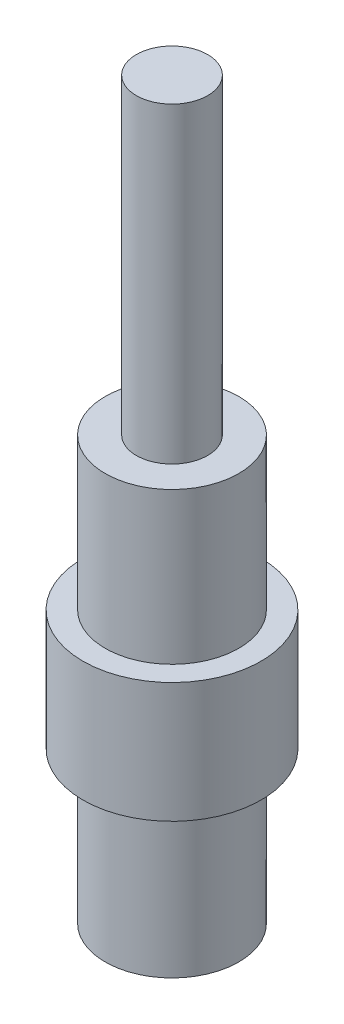
ISO-10303-21;
HEADER;
FILE_DESCRIPTION(('STEP AP214'),'2;1');
FILE_NAME('part.step','',(''),(''),'','','');
FILE_SCHEMA(('AUTOMOTIVE_DESIGN { 1 0 10303 214 1 1 1 1 }'));
ENDSEC;
DATA;
#1=APPLICATION_CONTEXT('core data for automotive mechanical design processes');
#2=APPLICATION_PROTOCOL_DEFINITION('international standard','automotive_design',2000,#1);
#3=PRODUCT_CONTEXT('',#1,'mechanical');
#4=PRODUCT('Part','Part','',(#3));
#5=PRODUCT_RELATED_PRODUCT_CATEGORY('part','',(#4));
#6=PRODUCT_DEFINITION_FORMATION('','',#4);
#7=PRODUCT_DEFINITION_CONTEXT('part definition',#1,'design');
#8=PRODUCT_DEFINITION('design','',#6,#7);
#9=PRODUCT_DEFINITION_SHAPE('','',#8);
#10=(LENGTH_UNIT() NAMED_UNIT(*) SI_UNIT(.MILLI.,.METRE.));
#11=(NAMED_UNIT(*) PLANE_ANGLE_UNIT() SI_UNIT($,.RADIAN.));
#12=(NAMED_UNIT(*) SI_UNIT($,.STERADIAN.) SOLID_ANGLE_UNIT());
#13=UNCERTAINTY_MEASURE_WITH_UNIT(LENGTH_MEASURE(1.E-05),#10,'distance_accuracy_value','');
#14=(GEOMETRIC_REPRESENTATION_CONTEXT(3) GLOBAL_UNCERTAINTY_ASSIGNED_CONTEXT((#13)) GLOBAL_UNIT_ASSIGNED_CONTEXT((#10,
#11,#12)) REPRESENTATION_CONTEXT('',''));
#15=CARTESIAN_POINT('',(0.,0.,0.));
#16=DIRECTION('',(0.,0.,1.));
#17=DIRECTION('',(1.,0.,0.));
#18=AXIS2_PLACEMENT_3D('',#15,#16,#17);
#19=CARTESIAN_POINT('',(7.5,0.,0.));
#20=DIRECTION('',(0.,-1.,0.));
#21=DIRECTION('',(0.,0.,-1.));
#22=AXIS2_PLACEMENT_3D('',#19,#20,#21);
#23=PLANE('',#22);
#24=CARTESIAN_POINT('',(0.,0.,0.));
#25=DIRECTION('',(0.,-1.,0.));
#26=DIRECTION('',(0.,0.,-1.));
#27=AXIS2_PLACEMENT_3D('',#24,#25,#26);
#28=CIRCLE('',#27,7.5);
#29=CARTESIAN_POINT('',(0.,0.,-7.5));
#30=VERTEX_POINT('',#29);
#31=EDGE_CURVE('E10',#30,#30,#28,.T.);
#32=ORIENTED_EDGE('',*,*,#31,.T.);
#33=EDGE_LOOP('',(#32));
#34=FACE_BOUND('',#33,.T.);
#35=ADVANCED_FACE('F32',(#34),#23,.T.);
#36=CARTESIAN_POINT('',(0.,0.,0.));
#37=DIRECTION('',(0.,-1.,0.));
#38=DIRECTION('',(0.,0.,-1.));
#39=AXIS2_PLACEMENT_3D('',#36,#37,#38);
#40=CYLINDRICAL_SURFACE('',#39,7.5);
#41=CARTESIAN_POINT('',(0.,17.,0.));
#42=DIRECTION('',(0.,-1.,0.));
#43=DIRECTION('',(0.,0.,-1.));
#44=AXIS2_PLACEMENT_3D('',#41,#42,#43);
#45=CIRCLE('',#44,7.5);
#46=CARTESIAN_POINT('',(0.,17.,-7.5));
#47=VERTEX_POINT('',#46);
#48=EDGE_CURVE('E38',#47,#47,#45,.T.);
#49=ORIENTED_EDGE('',*,*,#48,.T.);
#50=EDGE_LOOP('',(#49));
#51=FACE_BOUND('',#50,.T.);
#52=ORIENTED_EDGE('',*,*,#31,.F.);
#53=EDGE_LOOP('',(#52));
#54=FACE_BOUND('',#53,.T.);
#55=ADVANCED_FACE('F76',(#51,#54),#40,.T.);
#56=CARTESIAN_POINT('',(10.,17.,0.));
#57=DIRECTION('',(0.,-1.,0.));
#58=DIRECTION('',(0.,0.,-1.));
#59=AXIS2_PLACEMENT_3D('',#56,#57,#58);
#60=PLANE('',#59);
#61=CARTESIAN_POINT('',(0.,17.,0.));
#62=DIRECTION('',(0.,-1.,0.));
#63=DIRECTION('',(0.,0.,-1.));
#64=AXIS2_PLACEMENT_3D('',#61,#62,#63);
#65=CIRCLE('',#64,10.);
#66=CARTESIAN_POINT('',(0.,17.,-10.));
#67=VERTEX_POINT('',#66);
#68=EDGE_CURVE('E42',#67,#67,#65,.T.);
#69=ORIENTED_EDGE('',*,*,#68,.T.);
#70=EDGE_LOOP('',(#69));
#71=FACE_BOUND('',#70,.T.);
#72=ORIENTED_EDGE('',*,*,#48,.F.);
#73=EDGE_LOOP('',(#72));
#74=FACE_BOUND('',#73,.T.);
#75=ADVANCED_FACE('F80',(#71,#74),#60,.T.);
#76=CARTESIAN_POINT('',(0.,0.,0.));
#77=DIRECTION('',(0.,-1.,0.));
#78=DIRECTION('',(0.,0.,-1.));
#79=AXIS2_PLACEMENT_3D('',#76,#77,#78);
#80=CYLINDRICAL_SURFACE('',#79,10.);
#81=CARTESIAN_POINT('',(0.,30.5,0.));
#82=DIRECTION('',(0.,-1.,0.));
#83=DIRECTION('',(0.,0.,-1.));
#84=AXIS2_PLACEMENT_3D('',#81,#82,#83);
#85=CIRCLE('',#84,10.);
#86=CARTESIAN_POINT('',(0.,30.5,-10.));
#87=VERTEX_POINT('',#86);
#88=EDGE_CURVE('E46',#87,#87,#85,.T.);
#89=ORIENTED_EDGE('',*,*,#88,.T.);
#90=EDGE_LOOP('',(#89));
#91=FACE_BOUND('',#90,.T.);
#92=ORIENTED_EDGE('',*,*,#68,.F.);
#93=EDGE_LOOP('',(#92));
#94=FACE_BOUND('',#93,.T.);
#95=ADVANCED_FACE('F84',(#91,#94),#80,.T.);
#96=CARTESIAN_POINT('',(7.5,30.5,0.));
#97=DIRECTION('',(0.,1.,0.));
#98=DIRECTION('',(0.,0.,1.));
#99=AXIS2_PLACEMENT_3D('',#96,#97,#98);
#100=PLANE('',#99);
#101=CARTESIAN_POINT('',(0.,30.5,0.));
#102=DIRECTION('',(0.,-1.,0.));
#103=DIRECTION('',(0.,0.,-1.));
#104=AXIS2_PLACEMENT_3D('',#101,#102,#103);
#105=CIRCLE('',#104,7.5);
#106=CARTESIAN_POINT('',(0.,30.5,-7.5));
#107=VERTEX_POINT('',#106);
#108=EDGE_CURVE('E51',#107,#107,#105,.T.);
#109=ORIENTED_EDGE('',*,*,#108,.T.);
#110=EDGE_LOOP('',(#109));
#111=FACE_BOUND('',#110,.T.);
#112=ORIENTED_EDGE('',*,*,#88,.F.);
#113=EDGE_LOOP('',(#112));
#114=FACE_BOUND('',#113,.T.);
#115=ADVANCED_FACE('F91',(#111,#114),#100,.T.);
#116=CARTESIAN_POINT('',(0.,0.,0.));
#117=DIRECTION('',(0.,-1.,0.));
#118=DIRECTION('',(0.,0.,-1.));
#119=AXIS2_PLACEMENT_3D('',#116,#117,#118);
#120=CYLINDRICAL_SURFACE('',#119,7.49999999999999);
#121=CARTESIAN_POINT('',(0.,47.5,0.));
#122=DIRECTION('',(0.,-1.,0.));
#123=DIRECTION('',(0.,0.,-1.));
#124=AXIS2_PLACEMENT_3D('',#121,#122,#123);
#125=CIRCLE('',#124,7.49999999999999);
#126=CARTESIAN_POINT('',(0.,47.5,-7.49999999999999));
#127=VERTEX_POINT('',#126);
#128=EDGE_CURVE('E54',#127,#127,#125,.T.);
#129=ORIENTED_EDGE('',*,*,#128,.T.);
#130=EDGE_LOOP('',(#129));
#131=FACE_BOUND('',#130,.T.);
#132=ORIENTED_EDGE('',*,*,#108,.F.);
#133=EDGE_LOOP('',(#132));
#134=FACE_BOUND('',#133,.T.);
#135=ADVANCED_FACE('F95',(#131,#134),#120,.T.);
#136=CARTESIAN_POINT('',(4.,47.5,0.));
#137=DIRECTION('',(0.,1.,0.));
#138=DIRECTION('',(0.,0.,1.));
#139=AXIS2_PLACEMENT_3D('',#136,#137,#138);
#140=PLANE('',#139);
#141=CARTESIAN_POINT('',(0.,47.5,0.));
#142=DIRECTION('',(0.,-1.,0.));
#143=DIRECTION('',(0.,0.,-1.));
#144=AXIS2_PLACEMENT_3D('',#141,#142,#143);
#145=CIRCLE('',#144,4.);
#146=CARTESIAN_POINT('',(0.,47.5,-4.));
#147=VERTEX_POINT('',#146);
#148=EDGE_CURVE('E57',#147,#147,#145,.T.);
#149=ORIENTED_EDGE('',*,*,#148,.T.);
#150=EDGE_LOOP('',(#149));
#151=FACE_BOUND('',#150,.T.);
#152=ORIENTED_EDGE('',*,*,#128,.F.);
#153=EDGE_LOOP('',(#152));
#154=FACE_BOUND('',#153,.T.);
#155=ADVANCED_FACE('F73',(#151,#154),#140,.T.);
#156=CARTESIAN_POINT('',(0.,0.,0.));
#157=DIRECTION('',(0.,-1.,0.));
#158=DIRECTION('',(0.,0.,-1.));
#159=AXIS2_PLACEMENT_3D('',#156,#157,#158);
#160=CYLINDRICAL_SURFACE('',#159,4.);
#161=CARTESIAN_POINT('',(0.,82.5,0.));
#162=DIRECTION('',(0.,-1.,0.));
#163=DIRECTION('',(0.,0.,-1.));
#164=AXIS2_PLACEMENT_3D('',#161,#162,#163);
#165=CIRCLE('',#164,4.);
#166=CARTESIAN_POINT('',(0.,82.5,-4.));
#167=VERTEX_POINT('',#166);
#168=EDGE_CURVE('E60',#167,#167,#165,.T.);
#169=ORIENTED_EDGE('',*,*,#168,.T.);
#170=EDGE_LOOP('',(#169));
#171=FACE_BOUND('',#170,.T.);
#172=ORIENTED_EDGE('',*,*,#148,.F.);
#173=EDGE_LOOP('',(#172));
#174=FACE_BOUND('',#173,.T.);
#175=ADVANCED_FACE('F64',(#171,#174),#160,.T.);
#176=CARTESIAN_POINT('',(4.,82.5,0.));
#177=DIRECTION('',(0.,1.,0.));
#178=DIRECTION('',(0.,0.,1.));
#179=AXIS2_PLACEMENT_3D('',#176,#177,#178);
#180=PLANE('',#179);
#181=ORIENTED_EDGE('',*,*,#168,.F.);
#182=EDGE_LOOP('',(#181));
#183=FACE_BOUND('',#182,.T.);
#184=ADVANCED_FACE('F67',(#183),#180,.T.);
#185=CLOSED_SHELL('',(#35,#55,#75,#95,#115,#135,#155,#175,#184));
#186=MANIFOLD_SOLID_BREP('B2',#185);
#187=ADVANCED_BREP_SHAPE_REPRESENTATION('',(#18,#186),#14);
#188=SHAPE_DEFINITION_REPRESENTATION(#9,#187);
ENDSEC;
END-ISO-10303-21;
